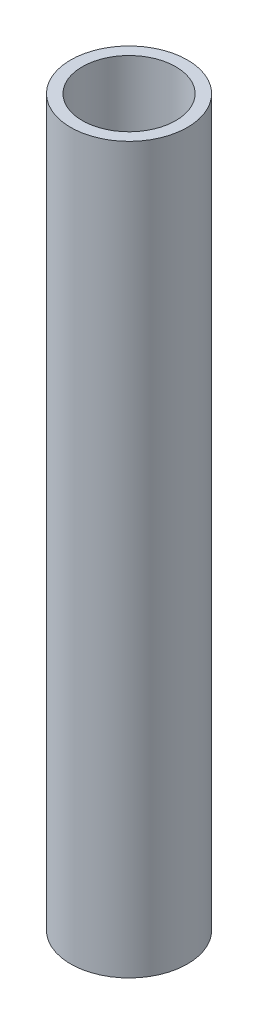
ISO-10303-21;
HEADER;
FILE_DESCRIPTION(('STEP AP214'),'2;1');
FILE_NAME('part.step','',(''),(''),'','','');
FILE_SCHEMA(('AUTOMOTIVE_DESIGN { 1 0 10303 214 1 1 1 1 }'));
ENDSEC;
DATA;
#1=APPLICATION_CONTEXT('core data for automotive mechanical design processes');
#2=APPLICATION_PROTOCOL_DEFINITION('international standard','automotive_design',2000,#1);
#3=PRODUCT_CONTEXT('',#1,'mechanical');
#4=PRODUCT('Part','Part','',(#3));
#5=PRODUCT_RELATED_PRODUCT_CATEGORY('part','',(#4));
#6=PRODUCT_DEFINITION_FORMATION('','',#4);
#7=PRODUCT_DEFINITION_CONTEXT('part definition',#1,'design');
#8=PRODUCT_DEFINITION('design','',#6,#7);
#9=PRODUCT_DEFINITION_SHAPE('','',#8);
#10=(LENGTH_UNIT() NAMED_UNIT(*) SI_UNIT(.MILLI.,.METRE.));
#11=(NAMED_UNIT(*) PLANE_ANGLE_UNIT() SI_UNIT($,.RADIAN.));
#12=(NAMED_UNIT(*) SI_UNIT($,.STERADIAN.) SOLID_ANGLE_UNIT());
#13=UNCERTAINTY_MEASURE_WITH_UNIT(LENGTH_MEASURE(1.E-05),#10,'distance_accuracy_value','');
#14=(GEOMETRIC_REPRESENTATION_CONTEXT(3) GLOBAL_UNCERTAINTY_ASSIGNED_CONTEXT((#13)) GLOBAL_UNIT_ASSIGNED_CONTEXT((#10,
#11,#12)) REPRESENTATION_CONTEXT('',''));
#15=CARTESIAN_POINT('',(0.,0.,0.));
#16=DIRECTION('',(0.,0.,1.));
#17=DIRECTION('',(1.,0.,0.));
#18=AXIS2_PLACEMENT_3D('',#15,#16,#17);
#19=CARTESIAN_POINT('',(15.875,0.,0.));
#20=DIRECTION('',(0.,-1.,0.));
#21=DIRECTION('',(0.,0.,-1.));
#22=AXIS2_PLACEMENT_3D('',#19,#20,#21);
#23=PLANE('',#22);
#24=CARTESIAN_POINT('',(0.,0.,0.));
#25=DIRECTION('',(0.,-1.,0.));
#26=DIRECTION('',(0.,0.,-1.));
#27=AXIS2_PLACEMENT_3D('',#24,#25,#26);
#28=CIRCLE('',#27,15.875);
#29=CARTESIAN_POINT('',(0.,0.,-15.875));
#30=VERTEX_POINT('',#29);
#31=EDGE_CURVE('E64',#30,#30,#28,.T.);
#32=ORIENTED_EDGE('',*,*,#31,.T.);
#33=EDGE_LOOP('',(#32));
#34=FACE_BOUND('',#33,.T.);
#35=CARTESIAN_POINT('',(0.,0.,0.));
#36=DIRECTION('',(0.,-1.,0.));
#37=DIRECTION('',(0.,0.,-1.));
#38=AXIS2_PLACEMENT_3D('',#35,#36,#37);
#39=CIRCLE('',#38,14.29);
#40=CARTESIAN_POINT('',(0.,0.,-14.29));
#41=VERTEX_POINT('',#40);
#42=EDGE_CURVE('E10',#41,#41,#39,.T.);
#43=ORIENTED_EDGE('',*,*,#42,.F.);
#44=EDGE_LOOP('',(#43));
#45=FACE_BOUND('',#44,.T.);
#46=ADVANCED_FACE('F37',(#34,#45),#23,.T.);
#47=CARTESIAN_POINT('',(0.,0.,0.));
#48=DIRECTION('',(0.,-1.,0.));
#49=DIRECTION('',(0.,0.,-1.));
#50=AXIS2_PLACEMENT_3D('',#47,#48,#49);
#51=CYLINDRICAL_SURFACE('',#50,14.29);
#52=ORIENTED_EDGE('',*,*,#42,.T.);
#53=EDGE_LOOP('',(#52));
#54=FACE_BOUND('',#53,.T.);
#55=CARTESIAN_POINT('',(0.,12.5,0.));
#56=DIRECTION('',(0.,-1.,0.));
#57=DIRECTION('',(0.,0.,-1.));
#58=AXIS2_PLACEMENT_3D('',#55,#56,#57);
#59=CIRCLE('',#58,14.29);
#60=CARTESIAN_POINT('',(0.,12.5,-14.29));
#61=VERTEX_POINT('',#60);
#62=EDGE_CURVE('E44',#61,#61,#59,.T.);
#63=ORIENTED_EDGE('',*,*,#62,.F.);
#64=EDGE_LOOP('',(#63));
#65=FACE_BOUND('',#64,.T.);
#66=ADVANCED_FACE('F83',(#54,#65),#51,.F.);
#67=CARTESIAN_POINT('',(0.,14.09,0.));
#68=DIRECTION('',(0.,-1.,0.));
#69=DIRECTION('',(0.,0.,-1.));
#70=AXIS2_PLACEMENT_3D('',#67,#68,#69);
#71=CONICAL_SURFACE('',#70,12.7,0.785398163397452);
#72=ORIENTED_EDGE('',*,*,#62,.T.);
#73=EDGE_LOOP('',(#72));
#74=FACE_BOUND('',#73,.T.);
#75=CARTESIAN_POINT('',(0.,14.09,0.));
#76=DIRECTION('',(0.,-1.,0.));
#77=DIRECTION('',(0.,0.,-1.));
#78=AXIS2_PLACEMENT_3D('',#75,#76,#77);
#79=CIRCLE('',#78,12.7);
#80=CARTESIAN_POINT('',(0.,14.09,-12.7));
#81=VERTEX_POINT('',#80);
#82=EDGE_CURVE('E49',#81,#81,#79,.T.);
#83=ORIENTED_EDGE('',*,*,#82,.F.);
#84=EDGE_LOOP('',(#83));
#85=FACE_BOUND('',#84,.T.);
#86=ADVANCED_FACE('F87',(#74,#85),#71,.F.);
#87=CARTESIAN_POINT('',(0.,0.,0.));
#88=DIRECTION('',(0.,-1.,0.));
#89=DIRECTION('',(0.,0.,-1.));
#90=AXIS2_PLACEMENT_3D('',#87,#88,#89);
#91=CYLINDRICAL_SURFACE('',#90,12.7);
#92=ORIENTED_EDGE('',*,*,#82,.T.);
#93=EDGE_LOOP('',(#92));
#94=FACE_BOUND('',#93,.T.);
#95=CARTESIAN_POINT('',(0.,196.85,0.));
#96=DIRECTION('',(0.,-1.,0.));
#97=DIRECTION('',(0.,0.,-1.));
#98=AXIS2_PLACEMENT_3D('',#95,#96,#97);
#99=CIRCLE('',#98,12.7);
#100=CARTESIAN_POINT('',(0.,196.85,-12.7));
#101=VERTEX_POINT('',#100);
#102=EDGE_CURVE('E54',#101,#101,#99,.T.);
#103=ORIENTED_EDGE('',*,*,#102,.F.);
#104=EDGE_LOOP('',(#103));
#105=FACE_BOUND('',#104,.T.);
#106=ADVANCED_FACE('F79',(#94,#105),#91,.F.);
#107=CARTESIAN_POINT('',(12.7,196.85,0.));
#108=DIRECTION('',(0.,1.,0.));
#109=DIRECTION('',(0.,0.,1.));
#110=AXIS2_PLACEMENT_3D('',#107,#108,#109);
#111=PLANE('',#110);
#112=ORIENTED_EDGE('',*,*,#102,.T.);
#113=EDGE_LOOP('',(#112));
#114=FACE_BOUND('',#113,.T.);
#115=CARTESIAN_POINT('',(0.,196.85,0.));
#116=DIRECTION('',(0.,-1.,0.));
#117=DIRECTION('',(0.,0.,-1.));
#118=AXIS2_PLACEMENT_3D('',#115,#116,#117);
#119=CIRCLE('',#118,15.875);
#120=CARTESIAN_POINT('',(0.,196.85,-15.875));
#121=VERTEX_POINT('',#120);
#122=EDGE_CURVE('E60',#121,#121,#119,.T.);
#123=ORIENTED_EDGE('',*,*,#122,.F.);
#124=EDGE_LOOP('',(#123));
#125=FACE_BOUND('',#124,.T.);
#126=ADVANCED_FACE('F73',(#114,#125),#111,.T.);
#127=CARTESIAN_POINT('',(0.,0.,0.));
#128=DIRECTION('',(0.,-1.,0.));
#129=DIRECTION('',(0.,0.,-1.));
#130=AXIS2_PLACEMENT_3D('',#127,#128,#129);
#131=CYLINDRICAL_SURFACE('',#130,15.875);
#132=ORIENTED_EDGE('',*,*,#122,.T.);
#133=EDGE_LOOP('',(#132));
#134=FACE_BOUND('',#133,.T.);
#135=ORIENTED_EDGE('',*,*,#31,.F.);
#136=EDGE_LOOP('',(#135));
#137=FACE_BOUND('',#136,.T.);
#138=ADVANCED_FACE('F71',(#134,#137),#131,.T.);
#139=CLOSED_SHELL('',(#46,#66,#86,#106,#126,#138));
#140=MANIFOLD_SOLID_BREP('B2',#139);
#141=ADVANCED_BREP_SHAPE_REPRESENTATION('',(#18,#140),#14);
#142=SHAPE_DEFINITION_REPRESENTATION(#9,#141);
ENDSEC;
END-ISO-10303-21;
